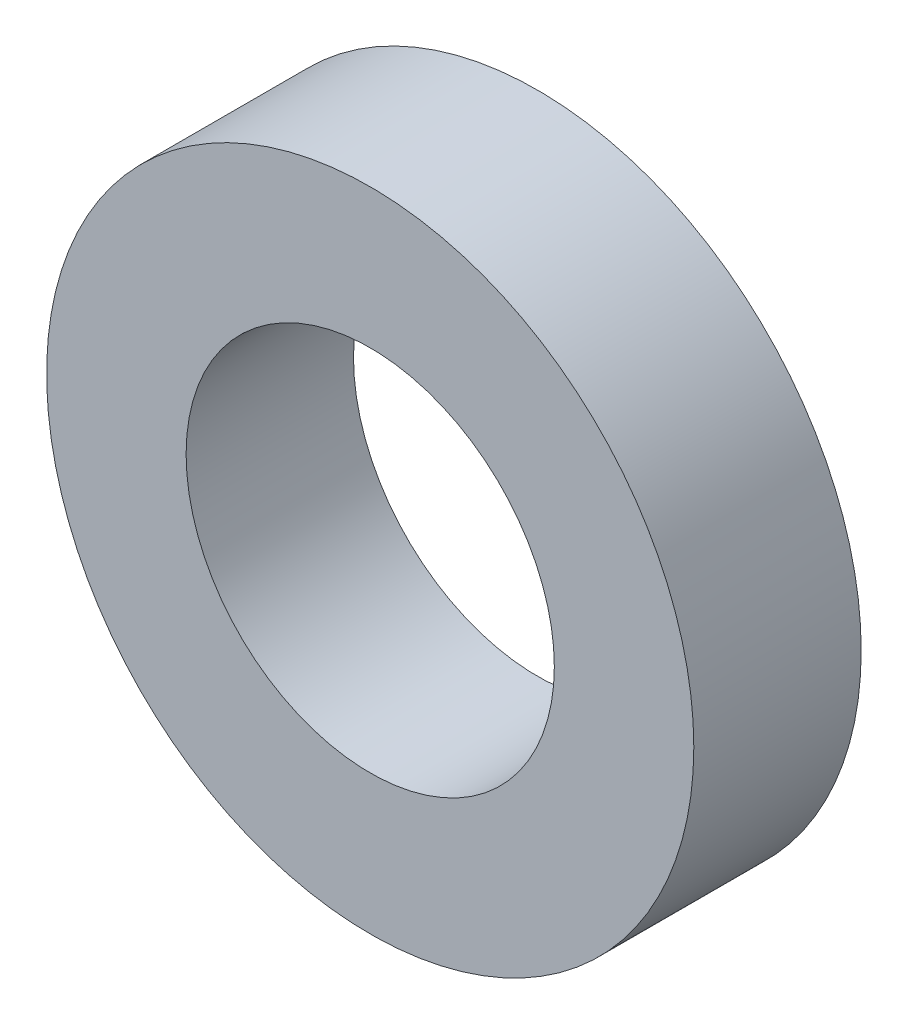
ISO-10303-21;
HEADER;
FILE_DESCRIPTION(('STEP AP214'),'2;1');
FILE_NAME('part.step','',(''),(''),'','','');
FILE_SCHEMA(('AUTOMOTIVE_DESIGN { 1 0 10303 214 1 1 1 1 }'));
ENDSEC;
DATA;
#1=APPLICATION_CONTEXT('core data for automotive mechanical design processes');
#2=APPLICATION_PROTOCOL_DEFINITION('international standard','automotive_design',2000,#1);
#3=PRODUCT_CONTEXT('',#1,'mechanical');
#4=PRODUCT('Part','Part','',(#3));
#5=PRODUCT_RELATED_PRODUCT_CATEGORY('part','',(#4));
#6=PRODUCT_DEFINITION_FORMATION('','',#4);
#7=PRODUCT_DEFINITION_CONTEXT('part definition',#1,'design');
#8=PRODUCT_DEFINITION('design','',#6,#7);
#9=PRODUCT_DEFINITION_SHAPE('','',#8);
#10=(LENGTH_UNIT() NAMED_UNIT(*) SI_UNIT(.MILLI.,.METRE.));
#11=(NAMED_UNIT(*) PLANE_ANGLE_UNIT() SI_UNIT($,.RADIAN.));
#12=(NAMED_UNIT(*) SI_UNIT($,.STERADIAN.) SOLID_ANGLE_UNIT());
#13=UNCERTAINTY_MEASURE_WITH_UNIT(LENGTH_MEASURE(1.E-05),#10,'distance_accuracy_value','');
#14=(GEOMETRIC_REPRESENTATION_CONTEXT(3) GLOBAL_UNCERTAINTY_ASSIGNED_CONTEXT((#13)) GLOBAL_UNIT_ASSIGNED_CONTEXT((#10,
#11,#12)) REPRESENTATION_CONTEXT('',''));
#15=CARTESIAN_POINT('',(0.,0.,0.));
#16=DIRECTION('',(0.,0.,1.));
#17=DIRECTION('',(1.,0.,0.));
#18=AXIS2_PLACEMENT_3D('',#15,#16,#17);
#19=CARTESIAN_POINT('',(0.,0.,1.5));
#20=DIRECTION('',(0.,0.,1.));
#21=DIRECTION('',(1.,0.,0.));
#22=AXIS2_PLACEMENT_3D('',#19,#20,#21);
#23=PLANE('',#22);
#24=CARTESIAN_POINT('',(0.,0.,1.5));
#25=DIRECTION('',(0.,0.,1.));
#26=DIRECTION('',(1.,0.,0.));
#27=AXIS2_PLACEMENT_3D('',#24,#25,#26);
#28=CIRCLE('',#27,2.9);
#29=CARTESIAN_POINT('',(2.9,0.,1.5));
#30=VERTEX_POINT('',#29);
#31=EDGE_CURVE('E10',#30,#30,#28,.T.);
#32=ORIENTED_EDGE('',*,*,#31,.T.);
#33=EDGE_LOOP('',(#32));
#34=FACE_BOUND('',#33,.T.);
#35=CARTESIAN_POINT('',(0.,0.,1.5));
#36=DIRECTION('',(0.,0.,1.));
#37=DIRECTION('',(1.,0.,0.));
#38=AXIS2_PLACEMENT_3D('',#35,#36,#37);
#39=CIRCLE('',#38,1.65);
#40=CARTESIAN_POINT('',(1.65,0.,1.5));
#41=VERTEX_POINT('',#40);
#42=EDGE_CURVE('E48',#41,#41,#39,.T.);
#43=ORIENTED_EDGE('',*,*,#42,.F.);
#44=EDGE_LOOP('',(#43));
#45=FACE_BOUND('',#44,.T.);
#46=ADVANCED_FACE('F37',(#34,#45),#23,.T.);
#47=CARTESIAN_POINT('',(0.,0.,0.));
#48=DIRECTION('',(0.,0.,1.));
#49=DIRECTION('',(1.,0.,0.));
#50=AXIS2_PLACEMENT_3D('',#47,#48,#49);
#51=PLANE('',#50);
#52=CARTESIAN_POINT('',(0.,0.,0.));
#53=DIRECTION('',(0.,0.,1.));
#54=DIRECTION('',(1.,0.,0.));
#55=AXIS2_PLACEMENT_3D('',#52,#53,#54);
#56=CIRCLE('',#55,2.9);
#57=CARTESIAN_POINT('',(2.9,0.,0.));
#58=VERTEX_POINT('',#57);
#59=EDGE_CURVE('E41',#58,#58,#56,.T.);
#60=ORIENTED_EDGE('',*,*,#59,.F.);
#61=EDGE_LOOP('',(#60));
#62=FACE_BOUND('',#61,.T.);
#63=CARTESIAN_POINT('',(0.,0.,0.));
#64=DIRECTION('',(0.,0.,1.));
#65=DIRECTION('',(1.,0.,0.));
#66=AXIS2_PLACEMENT_3D('',#63,#64,#65);
#67=CIRCLE('',#66,1.65);
#68=CARTESIAN_POINT('',(1.65,0.,0.));
#69=VERTEX_POINT('',#68);
#70=EDGE_CURVE('E50',#69,#69,#67,.T.);
#71=ORIENTED_EDGE('',*,*,#70,.T.);
#72=EDGE_LOOP('',(#71));
#73=FACE_BOUND('',#72,.T.);
#74=ADVANCED_FACE('F60',(#62,#73),#51,.F.);
#75=CARTESIAN_POINT('',(0.,0.,1.5));
#76=DIRECTION('',(0.,0.,-1.));
#77=DIRECTION('',(-1.,0.,0.));
#78=AXIS2_PLACEMENT_3D('',#75,#76,#77);
#79=CYLINDRICAL_SURFACE('',#78,2.9);
#80=ORIENTED_EDGE('',*,*,#31,.F.);
#81=EDGE_LOOP('',(#80));
#82=FACE_BOUND('',#81,.T.);
#83=ORIENTED_EDGE('',*,*,#59,.T.);
#84=EDGE_LOOP('',(#83));
#85=FACE_BOUND('',#84,.T.);
#86=ADVANCED_FACE('F39',(#82,#85),#79,.T.);
#87=CARTESIAN_POINT('',(0.,0.,1.5));
#88=DIRECTION('',(0.,0.,-1.));
#89=DIRECTION('',(-1.,0.,0.));
#90=AXIS2_PLACEMENT_3D('',#87,#88,#89);
#91=CYLINDRICAL_SURFACE('',#90,1.65);
#92=ORIENTED_EDGE('',*,*,#42,.T.);
#93=EDGE_LOOP('',(#92));
#94=FACE_BOUND('',#93,.T.);
#95=ORIENTED_EDGE('',*,*,#70,.F.);
#96=EDGE_LOOP('',(#95));
#97=FACE_BOUND('',#96,.T.);
#98=ADVANCED_FACE('F56',(#94,#97),#91,.F.);
#99=CLOSED_SHELL('',(#46,#74,#86,#98));
#100=MANIFOLD_SOLID_BREP('B2',#99);
#101=ADVANCED_BREP_SHAPE_REPRESENTATION('',(#18,#100),#14);
#102=SHAPE_DEFINITION_REPRESENTATION(#9,#101);
ENDSEC;
END-ISO-10303-21;
